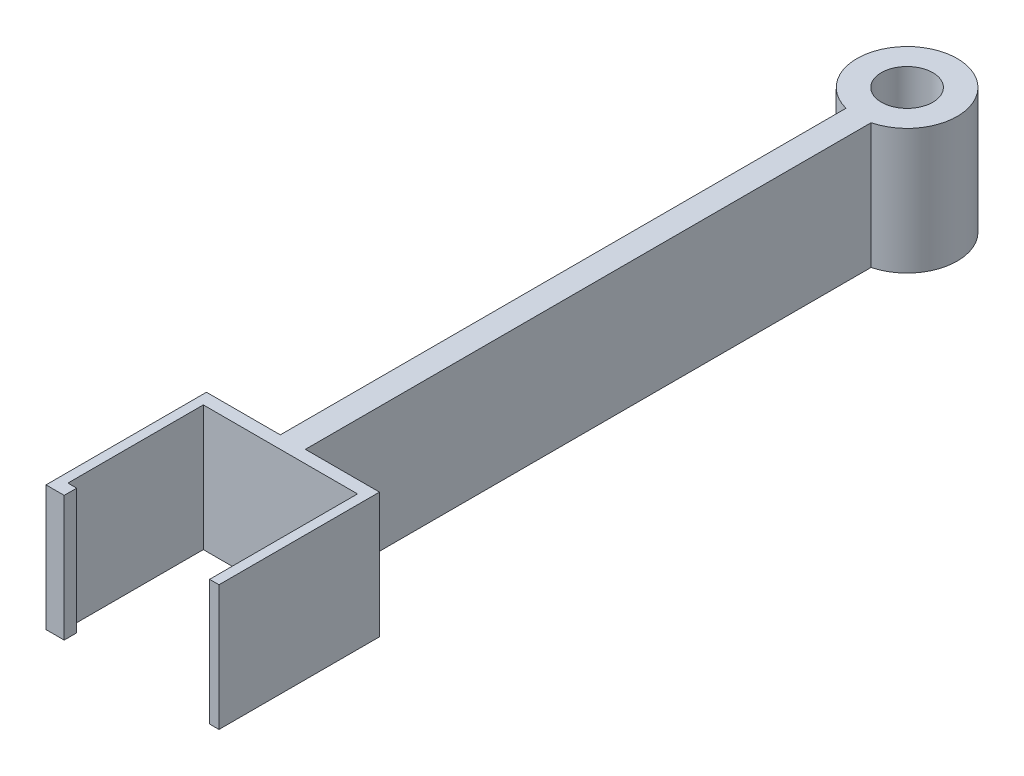
ISO-10303-21;
HEADER;
FILE_DESCRIPTION(('STEP AP214'),'2;1');
FILE_NAME('part.step','',(''),(''),'','','');
FILE_SCHEMA(('AUTOMOTIVE_DESIGN { 1 0 10303 214 1 1 1 1 }'));
ENDSEC;
DATA;
#1=APPLICATION_CONTEXT('core data for automotive mechanical design processes');
#2=APPLICATION_PROTOCOL_DEFINITION('international standard','automotive_design',2000,#1);
#3=PRODUCT_CONTEXT('',#1,'mechanical');
#4=PRODUCT('Part','Part','',(#3));
#5=PRODUCT_RELATED_PRODUCT_CATEGORY('part','',(#4));
#6=PRODUCT_DEFINITION_FORMATION('','',#4);
#7=PRODUCT_DEFINITION_CONTEXT('part definition',#1,'design');
#8=PRODUCT_DEFINITION('design','',#6,#7);
#9=PRODUCT_DEFINITION_SHAPE('','',#8);
#10=(LENGTH_UNIT() NAMED_UNIT(*) SI_UNIT(.MILLI.,.METRE.));
#11=(NAMED_UNIT(*) PLANE_ANGLE_UNIT() SI_UNIT($,.RADIAN.));
#12=(NAMED_UNIT(*) SI_UNIT($,.STERADIAN.) SOLID_ANGLE_UNIT());
#13=UNCERTAINTY_MEASURE_WITH_UNIT(LENGTH_MEASURE(1.E-05),#10,'distance_accuracy_value','');
#14=(GEOMETRIC_REPRESENTATION_CONTEXT(3) GLOBAL_UNCERTAINTY_ASSIGNED_CONTEXT((#13)) GLOBAL_UNIT_ASSIGNED_CONTEXT((#10,
#11,#12)) REPRESENTATION_CONTEXT('',''));
#15=CARTESIAN_POINT('',(0.,0.,0.));
#16=DIRECTION('',(0.,0.,1.));
#17=DIRECTION('',(1.,0.,0.));
#18=AXIS2_PLACEMENT_3D('',#15,#16,#17);
#19=CARTESIAN_POINT('',(0.990514547318201,10.,-5.4));
#20=DIRECTION('',(-1.,0.,0.));
#21=DIRECTION('',(0.,0.,1.));
#22=AXIS2_PLACEMENT_3D('',#19,#20,#21);
#23=PLANE('',#22);
#24=DIRECTION('',(0.,-1.,0.));
#25=VECTOR('',#24,1.);
#26=CARTESIAN_POINT('',(0.990514547318201,10.,-51.5270166537926));
#27=LINE('',#26,#25);
#28=CARTESIAN_POINT('',(0.990514547318201,10.,-51.5270166537926));
#29=VERTEX_POINT('',#28);
#30=CARTESIAN_POINT('',(0.990514547318201,0.,-51.5270166537926));
#31=VERTEX_POINT('',#30);
#32=EDGE_CURVE('E141',#29,#31,#27,.T.);
#33=ORIENTED_EDGE('',*,*,#32,.F.);
#34=DIRECTION('',(0.,0.,-1.));
#35=VECTOR('',#34,1.);
#36=CARTESIAN_POINT('',(0.990514547318201,10.,-5.4));
#37=LINE('',#36,#35);
#38=CARTESIAN_POINT('',(0.990514547318201,10.,-6.4));
#39=VERTEX_POINT('',#38);
#40=EDGE_CURVE('E163',#39,#29,#37,.T.);
#41=ORIENTED_EDGE('',*,*,#40,.F.);
#42=DIRECTION('',(0.,1.,0.));
#43=VECTOR('',#42,1.);
#44=CARTESIAN_POINT('',(0.9905145473182,10.,-6.4));
#45=LINE('',#44,#43);
#46=CARTESIAN_POINT('',(0.990514547318198,0.,-6.4));
#47=VERTEX_POINT('',#46);
#48=EDGE_CURVE('E158',#47,#39,#45,.T.);
#49=ORIENTED_EDGE('',*,*,#48,.F.);
#50=DIRECTION('',(0.,0.,-1.));
#51=VECTOR('',#50,1.);
#52=CARTESIAN_POINT('',(0.990514547318201,0.,-5.4));
#53=LINE('',#52,#51);
#54=EDGE_CURVE('E55',#47,#31,#53,.T.);
#55=ORIENTED_EDGE('',*,*,#54,.T.);
#56=EDGE_LOOP('',(#33,#41,#49,#55));
#57=FACE_BOUND('',#56,.T.);
#58=ADVANCED_FACE('F39',(#57),#23,.F.);
#59=CARTESIAN_POINT('',(-1.0094854526818,10.,-5.4));
#60=DIRECTION('',(-1.,0.,0.));
#61=DIRECTION('',(0.,0.,1.));
#62=AXIS2_PLACEMENT_3D('',#59,#60,#61);
#63=PLANE('',#62);
#64=DIRECTION('',(0.,0.,-1.));
#65=VECTOR('',#64,1.);
#66=CARTESIAN_POINT('',(-1.0094854526818,10.,-5.4));
#67=LINE('',#66,#65);
#68=CARTESIAN_POINT('',(-1.0094854526818,10.,-6.4));
#69=VERTEX_POINT('',#68);
#70=CARTESIAN_POINT('',(-1.0094854526818,10.,-51.5270166537926));
#71=VERTEX_POINT('',#70);
#72=EDGE_CURVE('E166',#69,#71,#67,.T.);
#73=ORIENTED_EDGE('',*,*,#72,.T.);
#74=DIRECTION('',(0.,-1.,0.));
#75=VECTOR('',#74,1.);
#76=CARTESIAN_POINT('',(-1.0094854526818,10.,-51.5270166537926));
#77=LINE('',#76,#75);
#78=CARTESIAN_POINT('',(-1.0094854526818,0.,-51.5270166537926));
#79=VERTEX_POINT('',#78);
#80=EDGE_CURVE('E11',#71,#79,#77,.T.);
#81=ORIENTED_EDGE('',*,*,#80,.T.);
#82=DIRECTION('',(0.,0.,-1.));
#83=VECTOR('',#82,1.);
#84=CARTESIAN_POINT('',(-1.0094854526818,0.,-5.4));
#85=LINE('',#84,#83);
#86=CARTESIAN_POINT('',(-1.0094854526818,0.,-6.4));
#87=VERTEX_POINT('',#86);
#88=EDGE_CURVE('E153',#87,#79,#85,.T.);
#89=ORIENTED_EDGE('',*,*,#88,.F.);
#90=DIRECTION('',(0.,1.,0.));
#91=VECTOR('',#90,1.);
#92=CARTESIAN_POINT('',(-1.0094854526818,10.,-6.4));
#93=LINE('',#92,#91);
#94=EDGE_CURVE('E169',#87,#69,#93,.T.);
#95=ORIENTED_EDGE('',*,*,#94,.T.);
#96=EDGE_LOOP('',(#73,#81,#89,#95));
#97=FACE_BOUND('',#96,.T.);
#98=ADVANCED_FACE('F304',(#97),#63,.T.);
#99=CARTESIAN_POINT('',(-6.9,10.,-6.4));
#100=DIRECTION('',(0.,0.,-1.));
#101=DIRECTION('',(-1.,0.,0.));
#102=AXIS2_PLACEMENT_3D('',#99,#100,#101);
#103=PLANE('',#102);
#104=DIRECTION('',(1.,0.,0.));
#105=VECTOR('',#104,1.);
#106=CARTESIAN_POINT('',(-6.9,0.,-6.4));
#107=LINE('',#106,#105);
#108=CARTESIAN_POINT('',(6.9,0.,-6.4));
#109=VERTEX_POINT('',#108);
#110=EDGE_CURVE('E225',#47,#109,#107,.T.);
#111=ORIENTED_EDGE('',*,*,#110,.F.);
#112=ORIENTED_EDGE('',*,*,#48,.T.);
#113=DIRECTION('',(1.,0.,0.));
#114=VECTOR('',#113,1.);
#115=CARTESIAN_POINT('',(-6.9,10.,-6.4));
#116=LINE('',#115,#114);
#117=CARTESIAN_POINT('',(6.9,10.,-6.4));
#118=VERTEX_POINT('',#117);
#119=EDGE_CURVE('E231',#39,#118,#116,.T.);
#120=ORIENTED_EDGE('',*,*,#119,.T.);
#121=DIRECTION('',(0.,-1.,0.));
#122=VECTOR('',#121,1.);
#123=CARTESIAN_POINT('',(6.9,10.,-6.4));
#124=LINE('',#123,#122);
#125=EDGE_CURVE('E243',#118,#109,#124,.T.);
#126=ORIENTED_EDGE('',*,*,#125,.T.);
#127=EDGE_LOOP('',(#111,#112,#120,#126));
#128=FACE_BOUND('',#127,.T.);
#129=ADVANCED_FACE('F339',(#128),#103,.T.);
#130=CARTESIAN_POINT('',(-6.9,10.,6.4));
#131=DIRECTION('',(0.,0.,-1.));
#132=DIRECTION('',(-1.,0.,0.));
#133=AXIS2_PLACEMENT_3D('',#130,#131,#132);
#134=PLANE('',#133);
#135=DIRECTION('',(0.,-1.,0.));
#136=VECTOR('',#135,1.);
#137=CARTESIAN_POINT('',(-5.44902090029537,10.,6.4));
#138=LINE('',#137,#136);
#139=CARTESIAN_POINT('',(-5.44902090029537,10.,6.4));
#140=VERTEX_POINT('',#139);
#141=CARTESIAN_POINT('',(-5.44902090029537,0.,6.4));
#142=VERTEX_POINT('',#141);
#143=EDGE_CURVE('E180',#140,#142,#138,.T.);
#144=ORIENTED_EDGE('',*,*,#143,.F.);
#145=DIRECTION('',(1.,0.,0.));
#146=VECTOR('',#145,1.);
#147=CARTESIAN_POINT('',(-6.9,10.,6.4));
#148=LINE('',#147,#146);
#149=CARTESIAN_POINT('',(-6.9,10.,6.4));
#150=VERTEX_POINT('',#149);
#151=EDGE_CURVE('E236',#150,#140,#148,.T.);
#152=ORIENTED_EDGE('',*,*,#151,.F.);
#153=DIRECTION('',(0.,-1.,0.));
#154=VECTOR('',#153,1.);
#155=CARTESIAN_POINT('',(-6.9,10.,6.4));
#156=LINE('',#155,#154);
#157=CARTESIAN_POINT('',(-6.9,0.,6.4));
#158=VERTEX_POINT('',#157);
#159=EDGE_CURVE('E262',#150,#158,#156,.T.);
#160=ORIENTED_EDGE('',*,*,#159,.T.);
#161=DIRECTION('',(1.,0.,0.));
#162=VECTOR('',#161,1.);
#163=CARTESIAN_POINT('',(-6.9,0.,6.4));
#164=LINE('',#163,#162);
#165=EDGE_CURVE('E252',#158,#142,#164,.T.);
#166=ORIENTED_EDGE('',*,*,#165,.T.);
#167=EDGE_LOOP('',(#144,#152,#160,#166));
#168=FACE_BOUND('',#167,.T.);
#169=ADVANCED_FACE('F292',(#168),#134,.F.);
#170=CARTESIAN_POINT('',(-6.15,10.,5.4));
#171=DIRECTION('',(0.,0.,-1.));
#172=DIRECTION('',(-1.,0.,0.));
#173=AXIS2_PLACEMENT_3D('',#170,#171,#172);
#174=PLANE('',#173);
#175=DIRECTION('',(1.,0.,0.));
#176=VECTOR('',#175,1.);
#177=CARTESIAN_POINT('',(-6.15,10.,5.4));
#178=LINE('',#177,#176);
#179=CARTESIAN_POINT('',(-6.15,10.,5.4));
#180=VERTEX_POINT('',#179);
#181=CARTESIAN_POINT('',(-5.44902090029537,10.,5.4));
#182=VERTEX_POINT('',#181);
#183=EDGE_CURVE('E198',#180,#182,#178,.T.);
#184=ORIENTED_EDGE('',*,*,#183,.T.);
#185=DIRECTION('',(0.,-1.,0.));
#186=VECTOR('',#185,1.);
#187=CARTESIAN_POINT('',(-5.44902090029537,10.,5.4));
#188=LINE('',#187,#186);
#189=CARTESIAN_POINT('',(-5.44902090029537,0.,5.4));
#190=VERTEX_POINT('',#189);
#191=EDGE_CURVE('E48',#182,#190,#188,.T.);
#192=ORIENTED_EDGE('',*,*,#191,.T.);
#193=DIRECTION('',(1.,0.,0.));
#194=VECTOR('',#193,1.);
#195=CARTESIAN_POINT('',(-6.15,0.,5.4));
#196=LINE('',#195,#194);
#197=CARTESIAN_POINT('',(-6.15,0.,5.4));
#198=VERTEX_POINT('',#197);
#199=EDGE_CURVE('E191',#198,#190,#196,.T.);
#200=ORIENTED_EDGE('',*,*,#199,.F.);
#201=DIRECTION('',(0.,-1.,0.));
#202=VECTOR('',#201,1.);
#203=CARTESIAN_POINT('',(-6.15,10.,5.4));
#204=LINE('',#203,#202);
#205=EDGE_CURVE('E202',#180,#198,#204,.T.);
#206=ORIENTED_EDGE('',*,*,#205,.F.);
#207=EDGE_LOOP('',(#184,#192,#200,#206));
#208=FACE_BOUND('',#207,.T.);
#209=ADVANCED_FACE('F275',(#208),#174,.T.);
#210=CARTESIAN_POINT('',(0.,10.,0.));
#211=DIRECTION('',(0.,-1.,0.));
#212=DIRECTION('',(0.,0.,-1.));
#213=AXIS2_PLACEMENT_3D('',#210,#211,#212);
#214=PLANE('',#213);
#215=CARTESIAN_POINT('',(-0.00948545268179921,10.,-55.4));
#216=DIRECTION('',(0.,1.,0.));
#217=DIRECTION('',(0.,0.,1.));
#218=AXIS2_PLACEMENT_3D('',#215,#216,#217);
#219=CIRCLE('',#218,2.05);
#220=CARTESIAN_POINT('',(-0.00948545268179921,10.,-53.35));
#221=VERTEX_POINT('',#220);
#222=EDGE_CURVE('E155',#221,#221,#219,.T.);
#223=ORIENTED_EDGE('',*,*,#222,.F.);
#224=EDGE_LOOP('',(#223));
#225=FACE_BOUND('',#224,.T.);
#226=ORIENTED_EDGE('',*,*,#40,.T.);
#227=CARTESIAN_POINT('',(-0.00948545268179921,10.,-55.4));
#228=DIRECTION('',(0.,1.,0.));
#229=DIRECTION('',(0.,0.,1.));
#230=AXIS2_PLACEMENT_3D('',#227,#228,#229);
#231=CIRCLE('',#230,4.);
#232=EDGE_CURVE('E145',#29,#71,#231,.T.);
#233=ORIENTED_EDGE('',*,*,#232,.T.);
#234=ORIENTED_EDGE('',*,*,#72,.F.);
#235=CARTESIAN_POINT('',(-6.9,10.,-6.4));
#236=VERTEX_POINT('',#235);
#237=EDGE_CURVE('E226',#236,#69,#116,.T.);
#238=ORIENTED_EDGE('',*,*,#237,.F.);
#239=DIRECTION('',(0.,0.,1.));
#240=VECTOR('',#239,1.);
#241=CARTESIAN_POINT('',(-6.9,10.,-6.4));
#242=LINE('',#241,#240);
#243=EDGE_CURVE('E240',#236,#150,#242,.T.);
#244=ORIENTED_EDGE('',*,*,#243,.T.);
#245=ORIENTED_EDGE('',*,*,#151,.T.);
#246=DIRECTION('',(0.,0.,1.));
#247=VECTOR('',#246,1.);
#248=CARTESIAN_POINT('',(-5.44902090029537,10.,0.));
#249=LINE('',#248,#247);
#250=EDGE_CURVE('E174',#182,#140,#249,.T.);
#251=ORIENTED_EDGE('',*,*,#250,.F.);
#252=ORIENTED_EDGE('',*,*,#183,.F.);
#253=DIRECTION('',(0.,0.,1.));
#254=VECTOR('',#253,1.);
#255=CARTESIAN_POINT('',(-6.15,10.,-5.4));
#256=LINE('',#255,#254);
#257=CARTESIAN_POINT('',(-6.15,10.,-5.4));
#258=VERTEX_POINT('',#257);
#259=EDGE_CURVE('E194',#258,#180,#256,.T.);
#260=ORIENTED_EDGE('',*,*,#259,.F.);
#261=DIRECTION('',(-1.,0.,0.));
#262=VECTOR('',#261,1.);
#263=CARTESIAN_POINT('',(-6.15,10.,-5.4));
#264=LINE('',#263,#262);
#265=CARTESIAN_POINT('',(6.15,10.,-5.4));
#266=VERTEX_POINT('',#265);
#267=EDGE_CURVE('E190',#266,#258,#264,.T.);
#268=ORIENTED_EDGE('',*,*,#267,.F.);
#269=DIRECTION('',(0.,0.,-1.));
#270=VECTOR('',#269,1.);
#271=CARTESIAN_POINT('',(6.15,10.,-5.4));
#272=LINE('',#271,#270);
#273=CARTESIAN_POINT('',(6.15,10.,6.4));
#274=VERTEX_POINT('',#273);
#275=EDGE_CURVE('E187',#274,#266,#272,.T.);
#276=ORIENTED_EDGE('',*,*,#275,.F.);
#277=CARTESIAN_POINT('',(6.9,10.,6.4));
#278=VERTEX_POINT('',#277);
#279=EDGE_CURVE('E235',#274,#278,#148,.T.);
#280=ORIENTED_EDGE('',*,*,#279,.T.);
#281=DIRECTION('',(0.,0.,1.));
#282=VECTOR('',#281,1.);
#283=CARTESIAN_POINT('',(6.9,10.,-6.4));
#284=LINE('',#283,#282);
#285=EDGE_CURVE('E230',#118,#278,#284,.T.);
#286=ORIENTED_EDGE('',*,*,#285,.F.);
#287=ORIENTED_EDGE('',*,*,#119,.F.);
#288=EDGE_LOOP('',(#226,#233,#234,#238,#244,#245,#251,#252,#260,#268,#276,#280,#286,#287));
#289=FACE_BOUND('',#288,.T.);
#290=ADVANCED_FACE('F287',(#225,#289),#214,.F.);
#291=CARTESIAN_POINT('',(0.,0.,0.));
#292=DIRECTION('',(0.,-1.,0.));
#293=DIRECTION('',(0.,0.,-1.));
#294=AXIS2_PLACEMENT_3D('',#291,#292,#293);
#295=PLANE('',#294);
#296=CARTESIAN_POINT('',(-0.00948545268179921,0.,-55.4));
#297=DIRECTION('',(0.,1.,0.));
#298=DIRECTION('',(0.,0.,1.));
#299=AXIS2_PLACEMENT_3D('',#296,#297,#298);
#300=CIRCLE('',#299,2.05);
#301=CARTESIAN_POINT('',(-0.00948545268179921,0.,-53.35));
#302=VERTEX_POINT('',#301);
#303=EDGE_CURVE('E311',#302,#302,#300,.T.);
#304=ORIENTED_EDGE('',*,*,#303,.T.);
#305=EDGE_LOOP('',(#304));
#306=FACE_BOUND('',#305,.T.);
#307=ORIENTED_EDGE('',*,*,#88,.T.);
#308=CARTESIAN_POINT('',(-0.00948545268179921,0.,-55.4));
#309=DIRECTION('',(0.,1.,0.));
#310=DIRECTION('',(0.,0.,1.));
#311=AXIS2_PLACEMENT_3D('',#308,#309,#310);
#312=CIRCLE('',#311,4.);
#313=EDGE_CURVE('E143',#31,#79,#312,.T.);
#314=ORIENTED_EDGE('',*,*,#313,.F.);
#315=ORIENTED_EDGE('',*,*,#54,.F.);
#316=ORIENTED_EDGE('',*,*,#110,.T.);
#317=DIRECTION('',(0.,0.,1.));
#318=VECTOR('',#317,1.);
#319=CARTESIAN_POINT('',(6.9,0.,-6.4));
#320=LINE('',#319,#318);
#321=CARTESIAN_POINT('',(6.9,0.,6.4));
#322=VERTEX_POINT('',#321);
#323=EDGE_CURVE('E247',#109,#322,#320,.T.);
#324=ORIENTED_EDGE('',*,*,#323,.T.);
#325=CARTESIAN_POINT('',(6.15,0.,6.4));
#326=VERTEX_POINT('',#325);
#327=EDGE_CURVE('E251',#326,#322,#164,.T.);
#328=ORIENTED_EDGE('',*,*,#327,.F.);
#329=DIRECTION('',(0.,0.,-1.));
#330=VECTOR('',#329,1.);
#331=CARTESIAN_POINT('',(6.15,0.,-5.4));
#332=LINE('',#331,#330);
#333=CARTESIAN_POINT('',(6.15,0.,-5.4));
#334=VERTEX_POINT('',#333);
#335=EDGE_CURVE('E183',#326,#334,#332,.T.);
#336=ORIENTED_EDGE('',*,*,#335,.T.);
#337=DIRECTION('',(-1.,0.,0.));
#338=VECTOR('',#337,1.);
#339=CARTESIAN_POINT('',(-6.15,0.,-5.4));
#340=LINE('',#339,#338);
#341=CARTESIAN_POINT('',(-6.15,0.,-5.4));
#342=VERTEX_POINT('',#341);
#343=EDGE_CURVE('E205',#334,#342,#340,.T.);
#344=ORIENTED_EDGE('',*,*,#343,.T.);
#345=DIRECTION('',(0.,0.,1.));
#346=VECTOR('',#345,1.);
#347=CARTESIAN_POINT('',(-6.15,0.,-5.4));
#348=LINE('',#347,#346);
#349=EDGE_CURVE('E208',#342,#198,#348,.T.);
#350=ORIENTED_EDGE('',*,*,#349,.T.);
#351=ORIENTED_EDGE('',*,*,#199,.T.);
#352=DIRECTION('',(0.,0.,1.));
#353=VECTOR('',#352,1.);
#354=CARTESIAN_POINT('',(-5.44902090029537,0.,0.));
#355=LINE('',#354,#353);
#356=EDGE_CURVE('E63',#190,#142,#355,.T.);
#357=ORIENTED_EDGE('',*,*,#356,.T.);
#358=ORIENTED_EDGE('',*,*,#165,.F.);
#359=DIRECTION('',(0.,0.,1.));
#360=VECTOR('',#359,1.);
#361=CARTESIAN_POINT('',(-6.9,0.,-6.4));
#362=LINE('',#361,#360);
#363=CARTESIAN_POINT('',(-6.9,0.,-6.4));
#364=VERTEX_POINT('',#363);
#365=EDGE_CURVE('E256',#364,#158,#362,.T.);
#366=ORIENTED_EDGE('',*,*,#365,.F.);
#367=EDGE_CURVE('E244',#364,#87,#107,.T.);
#368=ORIENTED_EDGE('',*,*,#367,.T.);
#369=EDGE_LOOP('',(#307,#314,#315,#316,#324,#328,#336,#344,#350,#351,#357,#358,#366,#368));
#370=FACE_BOUND('',#369,.T.);
#371=ADVANCED_FACE('F151',(#306,#370),#295,.T.);
#372=ORIENTED_EDGE('',*,*,#94,.F.);
#373=ORIENTED_EDGE('',*,*,#367,.F.);
#374=DIRECTION('',(0.,-1.,0.));
#375=VECTOR('',#374,1.);
#376=CARTESIAN_POINT('',(-6.9,10.,-6.4));
#377=LINE('',#376,#375);
#378=EDGE_CURVE('E259',#236,#364,#377,.T.);
#379=ORIENTED_EDGE('',*,*,#378,.F.);
#380=ORIENTED_EDGE('',*,*,#237,.T.);
#381=EDGE_LOOP('',(#372,#373,#379,#380));
#382=FACE_BOUND('',#381,.T.);
#383=ADVANCED_FACE('F41',(#382),#103,.T.);
#384=CARTESIAN_POINT('',(-6.9,10.,-6.4));
#385=DIRECTION('',(1.,0.,0.));
#386=DIRECTION('',(0.,0.,-1.));
#387=AXIS2_PLACEMENT_3D('',#384,#385,#386);
#388=PLANE('',#387);
#389=ORIENTED_EDGE('',*,*,#365,.T.);
#390=ORIENTED_EDGE('',*,*,#159,.F.);
#391=ORIENTED_EDGE('',*,*,#243,.F.);
#392=ORIENTED_EDGE('',*,*,#378,.T.);
#393=EDGE_LOOP('',(#389,#390,#391,#392));
#394=FACE_BOUND('',#393,.T.);
#395=ADVANCED_FACE('F379',(#394),#388,.F.);
#396=ORIENTED_EDGE('',*,*,#279,.F.);
#397=DIRECTION('',(0.,-1.,0.));
#398=VECTOR('',#397,1.);
#399=CARTESIAN_POINT('',(6.15,10.,6.4));
#400=LINE('',#399,#398);
#401=EDGE_CURVE('E177',#274,#326,#400,.T.);
#402=ORIENTED_EDGE('',*,*,#401,.T.);
#403=ORIENTED_EDGE('',*,*,#327,.T.);
#404=DIRECTION('',(0.,-1.,0.));
#405=VECTOR('',#404,1.);
#406=CARTESIAN_POINT('',(6.9,10.,6.4));
#407=LINE('',#406,#405);
#408=EDGE_CURVE('E266',#278,#322,#407,.T.);
#409=ORIENTED_EDGE('',*,*,#408,.F.);
#410=EDGE_LOOP('',(#396,#402,#403,#409));
#411=FACE_BOUND('',#410,.T.);
#412=ADVANCED_FACE('F357',(#411),#134,.F.);
#413=CARTESIAN_POINT('',(6.9,10.,-6.4));
#414=DIRECTION('',(1.,0.,0.));
#415=DIRECTION('',(0.,0.,-1.));
#416=AXIS2_PLACEMENT_3D('',#413,#414,#415);
#417=PLANE('',#416);
#418=ORIENTED_EDGE('',*,*,#323,.F.);
#419=ORIENTED_EDGE('',*,*,#125,.F.);
#420=ORIENTED_EDGE('',*,*,#285,.T.);
#421=ORIENTED_EDGE('',*,*,#408,.T.);
#422=EDGE_LOOP('',(#418,#419,#420,#421));
#423=FACE_BOUND('',#422,.T.);
#424=ADVANCED_FACE('F352',(#423),#417,.T.);
#425=CARTESIAN_POINT('',(6.15,10.,-5.4));
#426=DIRECTION('',(-1.,0.,0.));
#427=DIRECTION('',(0.,0.,1.));
#428=AXIS2_PLACEMENT_3D('',#425,#426,#427);
#429=PLANE('',#428);
#430=ORIENTED_EDGE('',*,*,#275,.T.);
#431=DIRECTION('',(0.,-1.,0.));
#432=VECTOR('',#431,1.);
#433=CARTESIAN_POINT('',(6.15,10.,-5.4));
#434=LINE('',#433,#432);
#435=EDGE_CURVE('E221',#266,#334,#434,.T.);
#436=ORIENTED_EDGE('',*,*,#435,.T.);
#437=ORIENTED_EDGE('',*,*,#335,.F.);
#438=ORIENTED_EDGE('',*,*,#401,.F.);
#439=EDGE_LOOP('',(#430,#436,#437,#438));
#440=FACE_BOUND('',#439,.T.);
#441=ADVANCED_FACE('F349',(#440),#429,.T.);
#442=CARTESIAN_POINT('',(-6.15,10.,-5.4));
#443=DIRECTION('',(0.,0.,1.));
#444=DIRECTION('',(1.,0.,0.));
#445=AXIS2_PLACEMENT_3D('',#442,#443,#444);
#446=PLANE('',#445);
#447=DIRECTION('',(0.,-1.,0.));
#448=VECTOR('',#447,1.);
#449=CARTESIAN_POINT('',(-6.15,10.,-5.4));
#450=LINE('',#449,#448);
#451=EDGE_CURVE('E217',#258,#342,#450,.T.);
#452=ORIENTED_EDGE('',*,*,#451,.T.);
#453=ORIENTED_EDGE('',*,*,#343,.F.);
#454=ORIENTED_EDGE('',*,*,#435,.F.);
#455=ORIENTED_EDGE('',*,*,#267,.T.);
#456=EDGE_LOOP('',(#452,#453,#454,#455));
#457=FACE_BOUND('',#456,.T.);
#458=ADVANCED_FACE('F347',(#457),#446,.T.);
#459=CARTESIAN_POINT('',(-6.15,10.,-5.4));
#460=DIRECTION('',(1.,0.,0.));
#461=DIRECTION('',(0.,0.,-1.));
#462=AXIS2_PLACEMENT_3D('',#459,#460,#461);
#463=PLANE('',#462);
#464=ORIENTED_EDGE('',*,*,#349,.F.);
#465=ORIENTED_EDGE('',*,*,#451,.F.);
#466=ORIENTED_EDGE('',*,*,#259,.T.);
#467=ORIENTED_EDGE('',*,*,#205,.T.);
#468=EDGE_LOOP('',(#464,#465,#466,#467));
#469=FACE_BOUND('',#468,.T.);
#470=ADVANCED_FACE('F283',(#469),#463,.T.);
#471=CARTESIAN_POINT('',(-5.44902090029537,10.,0.));
#472=DIRECTION('',(1.,0.,0.));
#473=DIRECTION('',(0.,0.,-1.));
#474=AXIS2_PLACEMENT_3D('',#471,#472,#473);
#475=PLANE('',#474);
#476=ORIENTED_EDGE('',*,*,#250,.T.);
#477=ORIENTED_EDGE('',*,*,#143,.T.);
#478=ORIENTED_EDGE('',*,*,#356,.F.);
#479=ORIENTED_EDGE('',*,*,#191,.F.);
#480=EDGE_LOOP('',(#476,#477,#478,#479));
#481=FACE_BOUND('',#480,.T.);
#482=ADVANCED_FACE('F290',(#481),#475,.T.);
#483=CARTESIAN_POINT('',(-0.00948545268179921,10.,-55.4));
#484=DIRECTION('',(0.,-1.,0.));
#485=DIRECTION('',(0.,0.,-1.));
#486=AXIS2_PLACEMENT_3D('',#483,#484,#485);
#487=CYLINDRICAL_SURFACE('',#486,4.);
#488=ORIENTED_EDGE('',*,*,#232,.F.);
#489=ORIENTED_EDGE('',*,*,#32,.T.);
#490=ORIENTED_EDGE('',*,*,#313,.T.);
#491=ORIENTED_EDGE('',*,*,#80,.F.);
#492=EDGE_LOOP('',(#488,#489,#490,#491));
#493=FACE_BOUND('',#492,.T.);
#494=ADVANCED_FACE('F142',(#493),#487,.T.);
#495=CARTESIAN_POINT('',(-0.00948545268179921,10.,-55.4));
#496=DIRECTION('',(0.,-1.,0.));
#497=DIRECTION('',(0.,0.,-1.));
#498=AXIS2_PLACEMENT_3D('',#495,#496,#497);
#499=CYLINDRICAL_SURFACE('',#498,2.05);
#500=ORIENTED_EDGE('',*,*,#222,.T.);
#501=EDGE_LOOP('',(#500));
#502=FACE_BOUND('',#501,.T.);
#503=ORIENTED_EDGE('',*,*,#303,.F.);
#504=EDGE_LOOP('',(#503));
#505=FACE_BOUND('',#504,.T.);
#506=ADVANCED_FACE('F319',(#502,#505),#499,.F.);
#507=CLOSED_SHELL('',(#58,#98,#129,#169,#209,#290,#371,#383,#395,#412,#424,#441,#458,#470,#482,
#494,#506));
#508=MANIFOLD_SOLID_BREP('B2',#507);
#509=ADVANCED_BREP_SHAPE_REPRESENTATION('',(#18,#508),#14);
#510=SHAPE_DEFINITION_REPRESENTATION(#9,#509);
ENDSEC;
END-ISO-10303-21;
